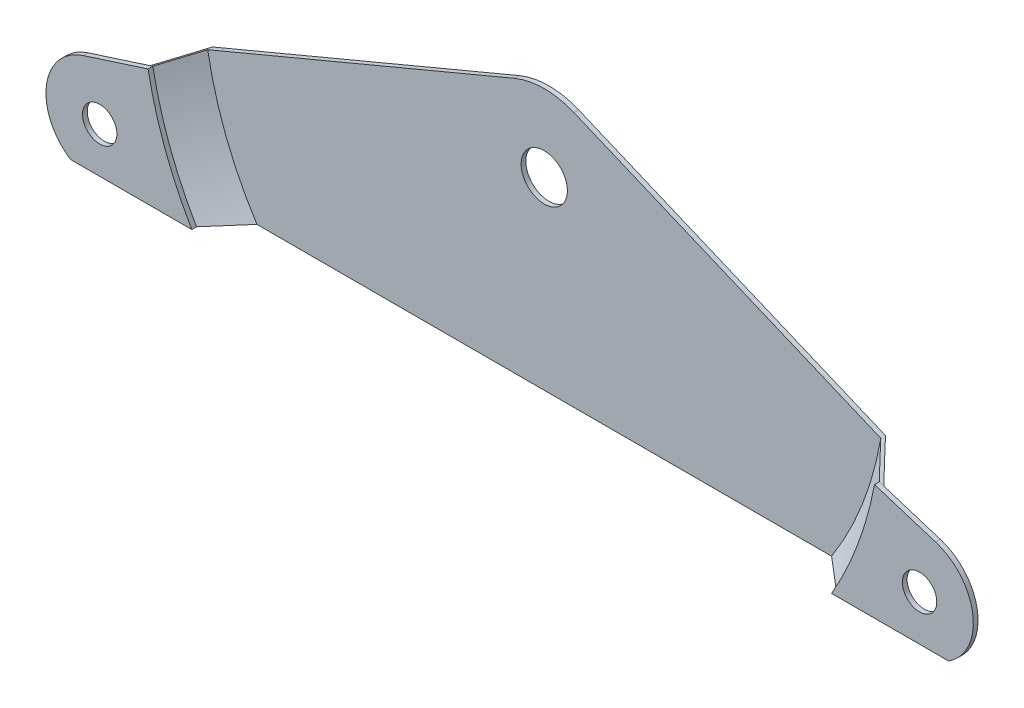
ISO-10303-21;
HEADER;
FILE_DESCRIPTION(('STEP AP214'),'2;1');
FILE_NAME('part.step','',(''),(''),'','','');
FILE_SCHEMA(('AUTOMOTIVE_DESIGN { 1 0 10303 214 1 1 1 1 }'));
ENDSEC;
DATA;
#1=APPLICATION_CONTEXT('core data for automotive mechanical design processes');
#2=APPLICATION_PROTOCOL_DEFINITION('international standard','automotive_design',2000,#1);
#3=PRODUCT_CONTEXT('',#1,'mechanical');
#4=PRODUCT('Part','Part','',(#3));
#5=PRODUCT_RELATED_PRODUCT_CATEGORY('part','',(#4));
#6=PRODUCT_DEFINITION_FORMATION('','',#4);
#7=PRODUCT_DEFINITION_CONTEXT('part definition',#1,'design');
#8=PRODUCT_DEFINITION('design','',#6,#7);
#9=PRODUCT_DEFINITION_SHAPE('','',#8);
#10=(LENGTH_UNIT() NAMED_UNIT(*) SI_UNIT(.MILLI.,.METRE.));
#11=(NAMED_UNIT(*) PLANE_ANGLE_UNIT() SI_UNIT($,.RADIAN.));
#12=(NAMED_UNIT(*) SI_UNIT($,.STERADIAN.) SOLID_ANGLE_UNIT());
#13=UNCERTAINTY_MEASURE_WITH_UNIT(LENGTH_MEASURE(1.E-05),#10,'distance_accuracy_value','');
#14=(GEOMETRIC_REPRESENTATION_CONTEXT(3) GLOBAL_UNCERTAINTY_ASSIGNED_CONTEXT((#13)) GLOBAL_UNIT_ASSIGNED_CONTEXT((#10,
#11,#12)) REPRESENTATION_CONTEXT('',''));
#15=CARTESIAN_POINT('',(0.,0.,0.));
#16=DIRECTION('',(0.,0.,1.));
#17=DIRECTION('',(1.,0.,0.));
#18=AXIS2_PLACEMENT_3D('',#15,#16,#17);
#19=CARTESIAN_POINT('',(0.,17.15,0.44));
#20=DIRECTION('',(0.,0.,1.));
#21=DIRECTION('',(1.,0.,0.));
#22=AXIS2_PLACEMENT_3D('',#19,#20,#21);
#23=PLANE('',#22);
#24=CARTESIAN_POINT('',(0.,17.15,0.44));
#25=DIRECTION('',(0.,0.,1.));
#26=DIRECTION('',(1.,0.,0.));
#27=AXIS2_PLACEMENT_3D('',#24,#25,#26);
#28=CIRCLE('',#27,31.7502897624573);
#29=CARTESIAN_POINT('',(26.72,0.,0.44));
#30=VERTEX_POINT('',#29);
#31=CARTESIAN_POINT('',(31.2934890172107,11.7835817224413,0.44));
#32=VERTEX_POINT('',#31);
#33=EDGE_CURVE('E83',#30,#32,#28,.T.);
#34=ORIENTED_EDGE('',*,*,#33,.T.);
#35=DIRECTION('',(0.922233709453363,-0.386632881617548,0.));
#36=VECTOR('',#35,1.);
#37=CARTESIAN_POINT('',(2.76442510356547,23.7439710225915,0.44));
#38=LINE('',#37,#36);
#39=CARTESIAN_POINT('',(2.76442510356547,23.7439710225915,0.44));
#40=VERTEX_POINT('',#39);
#41=EDGE_CURVE('E323',#40,#32,#38,.T.);
#42=ORIENTED_EDGE('',*,*,#41,.F.);
#43=CARTESIAN_POINT('',(0.,17.15,0.44));
#44=DIRECTION('',(0.,0.,1.));
#45=DIRECTION('',(1.,0.,0.));
#46=AXIS2_PLACEMENT_3D('',#43,#44,#45);
#47=CIRCLE('',#46,7.15);
#48=CARTESIAN_POINT('',(-2.76442510356547,23.7439710225915,0.44));
#49=VERTEX_POINT('',#48);
#50=EDGE_CURVE('E326',#40,#49,#47,.T.);
#51=ORIENTED_EDGE('',*,*,#50,.T.);
#52=DIRECTION('',(-0.922233709453363,-0.386632881617548,0.));
#53=VECTOR('',#52,1.);
#54=CARTESIAN_POINT('',(-2.76442510356547,23.7439710225915,0.44));
#55=LINE('',#54,#53);
#56=CARTESIAN_POINT('',(-31.2934890172107,11.7835817224414,0.44));
#57=VERTEX_POINT('',#56);
#58=EDGE_CURVE('E328',#49,#57,#55,.T.);
#59=ORIENTED_EDGE('',*,*,#58,.T.);
#60=CARTESIAN_POINT('',(0.,17.15,0.44));
#61=DIRECTION('',(0.,0.,1.));
#62=DIRECTION('',(1.,0.,0.));
#63=AXIS2_PLACEMENT_3D('',#60,#61,#62);
#64=CIRCLE('',#63,31.7502897624573);
#65=CARTESIAN_POINT('',(-26.72,0.,0.44));
#66=VERTEX_POINT('',#65);
#67=EDGE_CURVE('E331',#57,#66,#64,.T.);
#68=ORIENTED_EDGE('',*,*,#67,.T.);
#69=DIRECTION('',(1.,0.,0.));
#70=VECTOR('',#69,1.);
#71=CARTESIAN_POINT('',(-26.72,0.,0.44));
#72=LINE('',#71,#70);
#73=EDGE_CURVE('E54',#66,#30,#72,.T.);
#74=ORIENTED_EDGE('',*,*,#73,.T.);
#75=EDGE_LOOP('',(#34,#42,#51,#59,#68,#74));
#76=FACE_BOUND('',#75,.T.);
#77=CARTESIAN_POINT('',(0.,17.15,0.44));
#78=DIRECTION('',(0.,0.,1.));
#79=DIRECTION('',(1.,0.,0.));
#80=AXIS2_PLACEMENT_3D('',#77,#78,#79);
#81=CIRCLE('',#80,2.15);
#82=CARTESIAN_POINT('',(2.15,17.15,0.44));
#83=VERTEX_POINT('',#82);
#84=EDGE_CURVE('E316',#83,#83,#81,.T.);
#85=ORIENTED_EDGE('',*,*,#84,.F.);
#86=EDGE_LOOP('',(#85));
#87=FACE_BOUND('',#86,.T.);
#88=ADVANCED_FACE('F37',(#76,#87),#23,.T.);
#89=CARTESIAN_POINT('',(0.,17.15,0.));
#90=DIRECTION('',(0.,0.,1.));
#91=DIRECTION('',(1.,0.,0.));
#92=AXIS2_PLACEMENT_3D('',#89,#90,#91);
#93=PLANE('',#92);
#94=CARTESIAN_POINT('',(0.,17.15,0.));
#95=DIRECTION('',(0.,0.,1.));
#96=DIRECTION('',(1.,0.,0.));
#97=AXIS2_PLACEMENT_3D('',#94,#95,#96);
#98=CIRCLE('',#97,31.7502897624573);
#99=CARTESIAN_POINT('',(26.72,0.,0.));
#100=VERTEX_POINT('',#99);
#101=CARTESIAN_POINT('',(31.2934890172107,11.7835817224413,0.));
#102=VERTEX_POINT('',#101);
#103=EDGE_CURVE('E319',#100,#102,#98,.T.);
#104=ORIENTED_EDGE('',*,*,#103,.F.);
#105=DIRECTION('',(1.,0.,0.));
#106=VECTOR('',#105,1.);
#107=CARTESIAN_POINT('',(-26.72,0.,0.));
#108=LINE('',#107,#106);
#109=CARTESIAN_POINT('',(-26.72,0.,0.));
#110=VERTEX_POINT('',#109);
#111=EDGE_CURVE('E324',#110,#100,#108,.T.);
#112=ORIENTED_EDGE('',*,*,#111,.F.);
#113=CARTESIAN_POINT('',(0.,17.15,0.));
#114=DIRECTION('',(0.,0.,1.));
#115=DIRECTION('',(1.,0.,0.));
#116=AXIS2_PLACEMENT_3D('',#113,#114,#115);
#117=CIRCLE('',#116,31.7502897624573);
#118=CARTESIAN_POINT('',(-31.2934890172107,11.7835817224414,0.));
#119=VERTEX_POINT('',#118);
#120=EDGE_CURVE('E342',#119,#110,#117,.T.);
#121=ORIENTED_EDGE('',*,*,#120,.F.);
#122=DIRECTION('',(-0.922233709453363,-0.386632881617548,0.));
#123=VECTOR('',#122,1.);
#124=CARTESIAN_POINT('',(-2.76442510356547,23.7439710225915,0.));
#125=LINE('',#124,#123);
#126=CARTESIAN_POINT('',(-2.76442510356547,23.7439710225915,0.));
#127=VERTEX_POINT('',#126);
#128=EDGE_CURVE('E339',#127,#119,#125,.T.);
#129=ORIENTED_EDGE('',*,*,#128,.F.);
#130=CARTESIAN_POINT('',(0.,17.15,0.));
#131=DIRECTION('',(0.,0.,1.));
#132=DIRECTION('',(1.,0.,0.));
#133=AXIS2_PLACEMENT_3D('',#130,#131,#132);
#134=CIRCLE('',#133,7.15);
#135=CARTESIAN_POINT('',(2.76442510356547,23.7439710225915,0.));
#136=VERTEX_POINT('',#135);
#137=EDGE_CURVE('E71',#136,#127,#134,.T.);
#138=ORIENTED_EDGE('',*,*,#137,.F.);
#139=DIRECTION('',(0.922233709453363,-0.386632881617548,0.));
#140=VECTOR('',#139,1.);
#141=CARTESIAN_POINT('',(2.76442510356547,23.7439710225915,0.));
#142=LINE('',#141,#140);
#143=EDGE_CURVE('E336',#136,#102,#142,.T.);
#144=ORIENTED_EDGE('',*,*,#143,.T.);
#145=EDGE_LOOP('',(#104,#112,#121,#129,#138,#144));
#146=FACE_BOUND('',#145,.T.);
#147=CARTESIAN_POINT('',(0.,17.15,0.));
#148=DIRECTION('',(0.,0.,1.));
#149=DIRECTION('',(1.,0.,0.));
#150=AXIS2_PLACEMENT_3D('',#147,#148,#149);
#151=CIRCLE('',#150,2.15);
#152=CARTESIAN_POINT('',(2.15,17.15,0.));
#153=VERTEX_POINT('',#152);
#154=EDGE_CURVE('E307',#153,#153,#151,.T.);
#155=ORIENTED_EDGE('',*,*,#154,.T.);
#156=EDGE_LOOP('',(#155));
#157=FACE_BOUND('',#156,.T.);
#158=ADVANCED_FACE('F351',(#146,#157),#93,.F.);
#159=CARTESIAN_POINT('',(2.76442510356547,23.7439710225915,0.44));
#160=DIRECTION('',(0.386632881617548,0.922233709453363,0.));
#161=DIRECTION('',(-0.922233709453364,0.386632881617549,0.));
#162=AXIS2_PLACEMENT_3D('',#159,#160,#161);
#163=PLANE('',#162);
#164=ORIENTED_EDGE('',*,*,#143,.F.);
#165=DIRECTION('',(0.,0.,-1.));
#166=VECTOR('',#165,1.);
#167=CARTESIAN_POINT('',(2.76442510356547,23.7439710225915,0.44));
#168=LINE('',#167,#166);
#169=EDGE_CURVE('E11',#40,#136,#168,.T.);
#170=ORIENTED_EDGE('',*,*,#169,.F.);
#171=ORIENTED_EDGE('',*,*,#41,.T.);
#172=CARTESIAN_POINT('',(31.2934890172107,11.7835817224413,0.439999999999996));
#173=CARTESIAN_POINT('',(31.3937244432046,11.741559498362,0.547376328557561));
#174=CARTESIAN_POINT('',(31.4940485549675,11.6995000940819,0.654655292491744));
#175=CARTESIAN_POINT('',(31.6948676868934,11.6153096346956,0.869024973362242));
#176=CARTESIAN_POINT('',(31.7953627070515,11.5731785795913,0.976115690303785));
#177=CARTESIAN_POINT('',(31.9965171956317,11.4888475268735,1.19011536267099));
#178=CARTESIAN_POINT('',(32.0971766640494,11.4466475292617,1.2970243181013));
#179=CARTESIAN_POINT('',(32.2986539939737,11.3621811300716,1.51066658941956));
#180=CARTESIAN_POINT('',(32.3994718554765,11.3199147284949,1.61739990531165));
#181=CARTESIAN_POINT('',(32.6012602010364,11.2353179405865,1.83069676381163));
#182=CARTESIAN_POINT('',(32.7022306850901,11.1929875542561,1.9372603064232));
#183=CARTESIAN_POINT('',(32.9043187490583,11.1082651138252,2.15022325294046));
#184=CARTESIAN_POINT('',(33.0054363289699,11.0658730597259,2.25662265684941));
#185=CARTESIAN_POINT('',(33.3090241555674,10.9385983407276,2.57560581398307));
#186=CARTESIAN_POINT('',(33.5117074489869,10.8536263591277,2.78795122022613));
#187=CARTESIAN_POINT('',(33.7146543451012,10.7685438659855,3.));
#188=B_SPLINE_CURVE_WITH_KNOTS('',3,(#172,#173,#174,#175,#176,#177,#178,#179,#180,#181,#182,
#183,#184,#185,#186,#187),.UNSPECIFIED.,.F.,.F.,(4,2,2,2,2,2,2,4),(0.,0.45834929257985,
0.916698572435414,1.37504784060536,1.83339709803263,2.29174634557425,2.75009558401001,
3.66689417602485),.UNSPECIFIED.);
#189=CARTESIAN_POINT('',(33.7146543451012,10.7685438659855,3.));
#190=VERTEX_POINT('',#189);
#191=EDGE_CURVE('E264',#32,#190,#188,.T.);
#192=ORIENTED_EDGE('',*,*,#191,.T.);
#193=DIRECTION('',(0.922233709453363,-0.386632881617548,0.));
#194=VECTOR('',#193,1.);
#195=CARTESIAN_POINT('',(32.0769910670564,11.4551100431046,3.));
#196=LINE('',#195,#194);
#197=CARTESIAN_POINT('',(34.1365470888751,10.5916715552179,3.));
#198=VERTEX_POINT('',#197);
#199=EDGE_CURVE('E248',#190,#198,#196,.T.);
#200=ORIENTED_EDGE('',*,*,#199,.T.);
#201=CARTESIAN_POINT('',(31.2934890172107,11.7835817224413,0.));
#202=CARTESIAN_POINT('',(31.411073822907,11.7342860267898,0.125961616807111));
#203=CARTESIAN_POINT('',(31.528780611439,11.6849391916334,0.251789300614221));
#204=CARTESIAN_POINT('',(31.764427838143,11.5861475671549,0.503187160262692));
#205=CARTESIAN_POINT('',(31.8823682763046,11.5367027778371,0.628757336115454));
#206=CARTESIAN_POINT('',(32.1184724919191,11.4377195674975,0.879650544013821));
#207=CARTESIAN_POINT('',(32.236636269363,11.3881811464795,1.00497357606933));
#208=CARTESIAN_POINT('',(32.4731776054817,11.2890146798151,1.25538218371635));
#209=CARTESIAN_POINT('',(32.5915551641487,11.2393866341721,1.3804677593165));
#210=CARTESIAN_POINT('',(32.8285150243897,11.1400447074419,1.63041067141581));
#211=CARTESIAN_POINT('',(32.9470973259569,11.0903308263575,1.7552680079225));
#212=CARTESIAN_POINT('',(33.1844580794141,10.9908208310587,2.00476323693646));
#213=CARTESIAN_POINT('',(33.3032365312982,10.9410247168468,2.1294011294503));
#214=CARTESIAN_POINT('',(33.6598888715091,10.7915034831097,2.50303405643968));
#215=CARTESIAN_POINT('',(33.8980453261787,10.6916599018126,2.75171204610829));
#216=CARTESIAN_POINT('',(34.1365470888751,10.5916715552179,2.99999999999999));
#217=B_SPLINE_CURVE_WITH_KNOTS('',3,(#201,#202,#203,#204,#205,#206,#207,#208,#209,#210,#211,
#212,#213,#214,#215,#216),.UNSPECIFIED.,.F.,.F.,(4,2,2,2,2,2,2,4),(0.,0.537683056477287,
1.07536608914951,1.61304910027385,2.15073209186624,2.68841506573006,3.2260980234809,
4.30162011381698),.UNSPECIFIED.);
#218=EDGE_CURVE('E239',#102,#198,#217,.T.);
#219=ORIENTED_EDGE('',*,*,#218,.F.);
#220=EDGE_LOOP('',(#164,#170,#171,#192,#200,#219));
#221=FACE_BOUND('',#220,.T.);
#222=ADVANCED_FACE('F39',(#221),#163,.T.);
#223=CARTESIAN_POINT('',(0.,17.15,0.44));
#224=DIRECTION('',(0.,0.,-1.));
#225=DIRECTION('',(-1.,0.,0.));
#226=AXIS2_PLACEMENT_3D('',#223,#224,#225);
#227=CYLINDRICAL_SURFACE('',#226,7.15);
#228=ORIENTED_EDGE('',*,*,#137,.T.);
#229=DIRECTION('',(0.,0.,-1.));
#230=VECTOR('',#229,1.);
#231=CARTESIAN_POINT('',(-2.76442510356547,23.7439710225915,0.44));
#232=LINE('',#231,#230);
#233=EDGE_CURVE('E46',#49,#127,#232,.T.);
#234=ORIENTED_EDGE('',*,*,#233,.F.);
#235=ORIENTED_EDGE('',*,*,#50,.F.);
#236=ORIENTED_EDGE('',*,*,#169,.T.);
#237=EDGE_LOOP('',(#228,#234,#235,#236));
#238=FACE_BOUND('',#237,.T.);
#239=ADVANCED_FACE('F393',(#238),#227,.T.);
#240=CARTESIAN_POINT('',(-2.76442510356547,23.7439710225915,0.44));
#241=DIRECTION('',(0.386632881617548,-0.922233709453363,0.));
#242=DIRECTION('',(0.922233709453364,0.386632881617549,0.));
#243=AXIS2_PLACEMENT_3D('',#240,#241,#242);
#244=PLANE('',#243);
#245=ORIENTED_EDGE('',*,*,#128,.T.);
#246=CARTESIAN_POINT('',(-31.2934890172107,11.7835817224414,0.));
#247=CARTESIAN_POINT('',(-31.3935358678006,11.741638555819,0.144015507318277));
#248=CARTESIAN_POINT('',(-31.4936968584917,11.6996475376426,0.2879377617559));
#249=CARTESIAN_POINT('',(-31.6942392222848,11.6155731092142,0.575601627920605));
#250=CARTESIAN_POINT('',(-31.7946205953814,11.5734896989644,0.719343239652119));
#251=CARTESIAN_POINT('',(-31.9955958288291,11.4892337963172,1.00665168726992));
#252=CARTESIAN_POINT('',(-32.0961896891755,11.4470613039218,1.15021852316016));
#253=CARTESIAN_POINT('',(-32.2975824621525,11.3626303539848,1.43718298480388));
#254=CARTESIAN_POINT('',(-32.3983813747788,11.3203718964451,1.5805806105609));
#255=CARTESIAN_POINT('',(-32.6001771433053,11.2357719965674,1.86721200431611));
#256=CARTESIAN_POINT('',(-32.7011739992016,11.193430554231,2.01044577231745));
#257=CARTESIAN_POINT('',(-32.9033588262871,11.1086675472902,2.29675460648234));
#258=CARTESIAN_POINT('',(-33.004546797473,11.0662459826872,2.43982967264871));
#259=CARTESIAN_POINT('',(-33.3084084004745,10.9388564869692,2.86885311570798));
#260=CARTESIAN_POINT('',(-33.5113592626003,10.8537723311352,3.1545706826577));
#261=CARTESIAN_POINT('',(-33.7146543451012,10.7685438659856,3.44));
#262=B_SPLINE_CURVE_WITH_KNOTS('',3,(#246,#247,#248,#249,#250,#251,#252,#253,#254,#255,#256,
#257,#258,#259,#260,#261),.UNSPECIFIED.,.F.,.F.,(4,2,2,2,2,2,2,4),(0.,0.540908040717193,
1.08181606816377,1.62272408336761,2.16363208726768,2.70454008072246,3.24544806451752,
4.32737369835709),.UNSPECIFIED.);
#263=CARTESIAN_POINT('',(-33.7146543451012,10.7685438659856,3.44));
#264=VERTEX_POINT('',#263);
#265=EDGE_CURVE('E280',#119,#264,#262,.T.);
#266=ORIENTED_EDGE('',*,*,#265,.T.);
#267=DIRECTION('',(-0.922233709453363,-0.386632881617548,0.));
#268=VECTOR('',#267,1.);
#269=CARTESIAN_POINT('',(-32.0337255340358,11.4732484797449,3.44));
#270=LINE('',#269,#268);
#271=CARTESIAN_POINT('',(-33.4017072691771,10.8997423122341,3.44));
#272=VERTEX_POINT('',#271);
#273=EDGE_CURVE('E287',#272,#264,#270,.T.);
#274=ORIENTED_EDGE('',*,*,#273,.F.);
#275=CARTESIAN_POINT('',(-31.2934890172107,11.7835817224414,0.439999999999998));
#276=CARTESIAN_POINT('',(-31.3806899271586,11.7470240269817,0.565524065928203));
#277=CARTESIAN_POINT('',(-31.4679775724034,11.710429969028,0.690977273051971));
#278=CARTESIAN_POINT('',(-31.6427210628983,11.6371713377489,0.941745878989));
#279=CARTESIAN_POINT('',(-31.7301769081456,11.6005067644248,1.06706127780452));
#280=CARTESIAN_POINT('',(-31.9052515295779,11.5271093113837,1.31755817862386));
#281=CARTESIAN_POINT('',(-31.9928703057605,11.4903764316678,1.44273968062972));
#282=CARTESIAN_POINT('',(-32.1682657890497,11.4168444620253,1.69297252356436));
#283=CARTESIAN_POINT('',(-32.2560424961541,11.3800453720997,1.81802386449498));
#284=CARTESIAN_POINT('',(-32.4317490341395,11.3063829973632,2.06799999557107));
#285=CARTESIAN_POINT('',(-32.5196788650186,11.2695197125533,2.19292478571822));
#286=CARTESIAN_POINT('',(-32.6956870094469,11.1957308937637,2.44265130883514));
#287=CARTESIAN_POINT('',(-32.7837653229943,11.1588053597849,2.56745304180643));
#288=CARTESIAN_POINT('',(-33.0482303820857,11.0479322840823,2.94169833998582));
#289=CARTESIAN_POINT('',(-33.2248333729155,10.9738940847117,3.19096227027952));
#290=CARTESIAN_POINT('',(-33.4017072691771,10.8997423122341,3.44));
#291=B_SPLINE_CURVE_WITH_KNOTS('',3,(#275,#276,#277,#278,#279,#280,#281,#282,#283,#284,#285,
#286,#287,#288,#289,#290),.UNSPECIFIED.,.F.,.F.,(4,2,2,2,2,2,2,4),(0.,0.471455975874309,
0.942911944023858,1.4143679049737,1.88582385920898,2.35727980717827,2.82873574929661,
3.77172207501721),.UNSPECIFIED.);
#292=EDGE_CURVE('E300',#57,#272,#291,.T.);
#293=ORIENTED_EDGE('',*,*,#292,.F.);
#294=ORIENTED_EDGE('',*,*,#58,.F.);
#295=ORIENTED_EDGE('',*,*,#233,.T.);
#296=EDGE_LOOP('',(#245,#266,#274,#293,#294,#295));
#297=FACE_BOUND('',#296,.T.);
#298=ADVANCED_FACE('F347',(#297),#244,.F.);
#299=CARTESIAN_POINT('',(-26.72,0.,0.44));
#300=DIRECTION('',(0.,1.,0.));
#301=DIRECTION('',(0.,0.,1.));
#302=AXIS2_PLACEMENT_3D('',#299,#300,#301);
#303=PLANE('',#302);
#304=ORIENTED_EDGE('',*,*,#111,.T.);
#305=DIRECTION('',(0.76068664534764,0.,0.649119270696652));
#306=VECTOR('',#305,1.);
#307=CARTESIAN_POINT('',(26.72,0.,0.));
#308=LINE('',#307,#306);
#309=CARTESIAN_POINT('',(30.235625,0.,3.));
#310=VERTEX_POINT('',#309);
#311=EDGE_CURVE('E271',#100,#310,#308,.T.);
#312=ORIENTED_EDGE('',*,*,#311,.T.);
#313=DIRECTION('',(1.,0.,0.));
#314=VECTOR('',#313,1.);
#315=CARTESIAN_POINT('',(29.72,0.,3.));
#316=LINE('',#315,#314);
#317=CARTESIAN_POINT('',(40.606344477051,0.,3.));
#318=VERTEX_POINT('',#317);
#319=EDGE_CURVE('E215',#310,#318,#316,.T.);
#320=ORIENTED_EDGE('',*,*,#319,.T.);
#321=DIRECTION('',(0.,0.,-1.));
#322=VECTOR('',#321,1.);
#323=CARTESIAN_POINT('',(40.606344477051,0.,3.44));
#324=LINE('',#323,#322);
#325=CARTESIAN_POINT('',(40.606344477051,0.,3.44));
#326=VERTEX_POINT('',#325);
#327=EDGE_CURVE('E231',#326,#318,#324,.T.);
#328=ORIENTED_EDGE('',*,*,#327,.F.);
#329=DIRECTION('',(1.,0.,0.));
#330=VECTOR('',#329,1.);
#331=CARTESIAN_POINT('',(29.72,0.,3.44));
#332=LINE('',#331,#330);
#333=CARTESIAN_POINT('',(29.72,0.,3.44));
#334=VERTEX_POINT('',#333);
#335=EDGE_CURVE('E219',#334,#326,#332,.T.);
#336=ORIENTED_EDGE('',*,*,#335,.F.);
#337=DIRECTION('',(0.,0.,-1.));
#338=VECTOR('',#337,1.);
#339=CARTESIAN_POINT('',(29.72,0.,3.44));
#340=LINE('',#339,#338);
#341=CARTESIAN_POINT('',(29.72,0.,3.));
#342=VERTEX_POINT('',#341);
#343=EDGE_CURVE('E227',#334,#342,#340,.T.);
#344=ORIENTED_EDGE('',*,*,#343,.T.);
#345=DIRECTION('',(0.76068664534764,0.,0.649119270696653));
#346=VECTOR('',#345,1.);
#347=CARTESIAN_POINT('',(26.72,0.,0.44));
#348=LINE('',#347,#346);
#349=EDGE_CURVE('E230',#30,#342,#348,.T.);
#350=ORIENTED_EDGE('',*,*,#349,.F.);
#351=ORIENTED_EDGE('',*,*,#73,.F.);
#352=DIRECTION('',(-0.65726286253734,0.,0.753661415709483));
#353=VECTOR('',#352,1.);
#354=CARTESIAN_POINT('',(-26.72,0.,0.44));
#355=LINE('',#354,#353);
#356=CARTESIAN_POINT('',(-29.3362790697674,0.,3.44));
#357=VERTEX_POINT('',#356);
#358=EDGE_CURVE('E164',#66,#357,#355,.T.);
#359=ORIENTED_EDGE('',*,*,#358,.T.);
#360=DIRECTION('',(0.,0.,-1.));
#361=VECTOR('',#360,1.);
#362=CARTESIAN_POINT('',(-29.3362790697674,0.,3.88));
#363=LINE('',#362,#361);
#364=CARTESIAN_POINT('',(-29.3362790697674,0.,3.88));
#365=VERTEX_POINT('',#364);
#366=EDGE_CURVE('E159',#365,#357,#363,.T.);
#367=ORIENTED_EDGE('',*,*,#366,.F.);
#368=DIRECTION('',(-1.,0.,0.));
#369=VECTOR('',#368,1.);
#370=CARTESIAN_POINT('',(-29.3362790697674,0.,3.88));
#371=LINE('',#370,#369);
#372=CARTESIAN_POINT('',(-40.606344477051,0.,3.88));
#373=VERTEX_POINT('',#372);
#374=EDGE_CURVE('E163',#365,#373,#371,.T.);
#375=ORIENTED_EDGE('',*,*,#374,.T.);
#376=DIRECTION('',(0.,0.,-1.));
#377=VECTOR('',#376,1.);
#378=CARTESIAN_POINT('',(-40.606344477051,0.,3.88));
#379=LINE('',#378,#377);
#380=CARTESIAN_POINT('',(-40.606344477051,0.,3.44));
#381=VERTEX_POINT('',#380);
#382=EDGE_CURVE('E168',#373,#381,#379,.T.);
#383=ORIENTED_EDGE('',*,*,#382,.T.);
#384=DIRECTION('',(-1.,0.,0.));
#385=VECTOR('',#384,1.);
#386=CARTESIAN_POINT('',(-29.3362790697674,0.,3.44));
#387=LINE('',#386,#385);
#388=CARTESIAN_POINT('',(-29.72,0.,3.44));
#389=VERTEX_POINT('',#388);
#390=EDGE_CURVE('E194',#389,#381,#387,.T.);
#391=ORIENTED_EDGE('',*,*,#390,.F.);
#392=DIRECTION('',(-0.65726286253734,0.,0.753661415709483));
#393=VECTOR('',#392,1.);
#394=CARTESIAN_POINT('',(-26.72,0.,0.));
#395=LINE('',#394,#393);
#396=EDGE_CURVE('E79',#110,#389,#395,.T.);
#397=ORIENTED_EDGE('',*,*,#396,.F.);
#398=EDGE_LOOP('',(#304,#312,#320,#328,#336,#344,#350,#351,#359,#367,#375,#383,#391,#397));
#399=FACE_BOUND('',#398,.T.);
#400=ADVANCED_FACE('F161',(#399),#303,.F.);
#401=CARTESIAN_POINT('',(0.,17.15,0.44));
#402=DIRECTION('',(0.,0.,-1.));
#403=DIRECTION('',(-1.,0.,0.));
#404=AXIS2_PLACEMENT_3D('',#401,#402,#403);
#405=CYLINDRICAL_SURFACE('',#404,2.15);
#406=ORIENTED_EDGE('',*,*,#84,.T.);
#407=EDGE_LOOP('',(#406));
#408=FACE_BOUND('',#407,.T.);
#409=ORIENTED_EDGE('',*,*,#154,.F.);
#410=EDGE_LOOP('',(#409));
#411=FACE_BOUND('',#410,.T.);
#412=ADVANCED_FACE('F388',(#408,#411),#405,.F.);
#413=DIRECTION('',(-0.577590286868506,0.31366212870848,0.753661415709483));
#414=VECTOR('',#413,1.);
#415=CARTESIAN_POINT('',(-31.665440356893,14.8303476544855,0.44));
#416=LINE('',#415,#414);
#417=CARTESIAN_POINT('',(0.,17.15,0.44));
#418=DIRECTION('',(0.,0.,1.));
#419=AXIS1_PLACEMENT('',#417,#418);
#420=SURFACE_OF_REVOLUTION('',#416,#419);
#421=ORIENTED_EDGE('',*,*,#67,.F.);
#422=ORIENTED_EDGE('',*,*,#292,.T.);
#423=CARTESIAN_POINT('',(0.,17.15,3.44));
#424=DIRECTION('',(0.,0.,1.));
#425=DIRECTION('',(1.,0.,0.));
#426=AXIS2_PLACEMENT_3D('',#423,#424,#425);
#427=CIRCLE('',#426,33.981462147166);
#428=EDGE_CURVE('E288',#272,#357,#427,.T.);
#429=ORIENTED_EDGE('',*,*,#428,.T.);
#430=ORIENTED_EDGE('',*,*,#358,.F.);
#431=EDGE_LOOP('',(#421,#422,#429,#430));
#432=FACE_BOUND('',#431,.T.);
#433=ADVANCED_FACE('F296',(#432),#420,.F.);
#434=DIRECTION('',(-0.577590286868506,0.31366212870848,0.753661415709483));
#435=VECTOR('',#434,1.);
#436=CARTESIAN_POINT('',(-31.665440356893,14.8303476544855,0.));
#437=LINE('',#436,#435);
#438=CARTESIAN_POINT('',(0.,17.15,0.44));
#439=DIRECTION('',(0.,0.,1.));
#440=AXIS1_PLACEMENT('',#438,#439);
#441=SURFACE_OF_REVOLUTION('',#437,#440);
#442=ORIENTED_EDGE('',*,*,#265,.F.);
#443=ORIENTED_EDGE('',*,*,#120,.T.);
#444=ORIENTED_EDGE('',*,*,#396,.T.);
#445=CARTESIAN_POINT('',(0.,17.15,3.44));
#446=DIRECTION('',(0.,0.,1.));
#447=DIRECTION('',(1.,0.,0.));
#448=AXIS2_PLACEMENT_3D('',#445,#446,#447);
#449=CIRCLE('',#448,34.3132758564378);
#450=EDGE_CURVE('E309',#264,#389,#449,.T.);
#451=ORIENTED_EDGE('',*,*,#450,.F.);
#452=EDGE_LOOP('',(#442,#443,#444,#451));
#453=FACE_BOUND('',#452,.T.);
#454=ADVANCED_FACE('F290',(#453),#441,.T.);
#455=DIRECTION('',(0.662869450367109,0.373159837308696,0.649119270696652));
#456=VECTOR('',#455,1.);
#457=CARTESIAN_POINT('',(31.6971029675881,15.3130015073172,0.));
#458=LINE('',#457,#456);
#459=CARTESIAN_POINT('',(0.,17.15,0.44));
#460=DIRECTION('',(0.,0.,-1.));
#461=AXIS1_PLACEMENT('',#459,#460);
#462=SURFACE_OF_REVOLUTION('',#458,#461);
#463=ORIENTED_EDGE('',*,*,#103,.T.);
#464=ORIENTED_EDGE('',*,*,#218,.T.);
#465=CARTESIAN_POINT('',(0.,17.15,3.));
#466=DIRECTION('',(0.,0.,-1.));
#467=DIRECTION('',(-1.,0.,0.));
#468=AXIS2_PLACEMENT_3D('',#465,#466,#467);
#469=CIRCLE('',#468,34.7608331191964);
#470=EDGE_CURVE('E273',#198,#310,#469,.T.);
#471=ORIENTED_EDGE('',*,*,#470,.T.);
#472=ORIENTED_EDGE('',*,*,#311,.F.);
#473=EDGE_LOOP('',(#463,#464,#471,#472));
#474=FACE_BOUND('',#473,.T.);
#475=ADVANCED_FACE('F251',(#474),#462,.F.);
#476=DIRECTION('',(0.662869450367109,0.373159837308696,0.649119270696653));
#477=VECTOR('',#476,1.);
#478=CARTESIAN_POINT('',(31.6971029675881,15.3130015073172,0.44));
#479=LINE('',#478,#477);
#480=CARTESIAN_POINT('',(0.,17.15,0.44));
#481=DIRECTION('',(0.,0.,-1.));
#482=AXIS1_PLACEMENT('',#480,#481);
#483=SURFACE_OF_REVOLUTION('',#479,#482);
#484=ORIENTED_EDGE('',*,*,#191,.F.);
#485=ORIENTED_EDGE('',*,*,#33,.F.);
#486=ORIENTED_EDGE('',*,*,#349,.T.);
#487=CARTESIAN_POINT('',(0.,17.15,3.));
#488=DIRECTION('',(0.,0.,-1.));
#489=DIRECTION('',(-1.,0.,0.));
#490=AXIS2_PLACEMENT_3D('',#487,#488,#489);
#491=CIRCLE('',#490,34.3132758564378);
#492=EDGE_CURVE('E249',#190,#342,#491,.T.);
#493=ORIENTED_EDGE('',*,*,#492,.F.);
#494=EDGE_LOOP('',(#484,#485,#486,#493));
#495=FACE_BOUND('',#494,.T.);
#496=ADVANCED_FACE('F260',(#495),#483,.T.);
#497=CARTESIAN_POINT('',(0.,17.15,3.44));
#498=DIRECTION('',(0.,0.,1.));
#499=DIRECTION('',(1.,0.,0.));
#500=AXIS2_PLACEMENT_3D('',#497,#498,#499);
#501=PLANE('',#500);
#502=CARTESIAN_POINT('',(0.,17.15,3.44));
#503=DIRECTION('',(0.,0.,1.));
#504=DIRECTION('',(1.,0.,0.));
#505=AXIS2_PLACEMENT_3D('',#502,#503,#504);
#506=CIRCLE('',#505,34.3132758564378);
#507=CARTESIAN_POINT('',(33.7146543451012,10.7685438659855,3.44));
#508=VERTEX_POINT('',#507);
#509=EDGE_CURVE('E211',#334,#508,#506,.T.);
#510=ORIENTED_EDGE('',*,*,#509,.F.);
#511=ORIENTED_EDGE('',*,*,#335,.T.);
#512=CARTESIAN_POINT('',(37.9,4.20424780091941,3.44));
#513=DIRECTION('',(0.,0.,1.));
#514=DIRECTION('',(1.,0.,0.));
#515=AXIS2_PLACEMENT_3D('',#512,#513,#514);
#516=CIRCLE('',#515,5.);
#517=CARTESIAN_POINT('',(39.4050656399768,8.97234778092833,3.44));
#518=VERTEX_POINT('',#517);
#519=EDGE_CURVE('E217',#326,#518,#516,.T.);
#520=ORIENTED_EDGE('',*,*,#519,.T.);
#521=DIRECTION('',(-0.953619996001785,0.301013127995367,0.));
#522=VECTOR('',#521,1.);
#523=CARTESIAN_POINT('',(39.4050656399768,8.97234778092833,3.44));
#524=LINE('',#523,#522);
#525=EDGE_CURVE('E214',#518,#508,#524,.T.);
#526=ORIENTED_EDGE('',*,*,#525,.T.);
#527=EDGE_LOOP('',(#510,#511,#520,#526));
#528=FACE_BOUND('',#527,.T.);
#529=CARTESIAN_POINT('',(37.9,4.20424780091941,3.44));
#530=DIRECTION('',(0.,0.,1.));
#531=DIRECTION('',(1.,0.,0.));
#532=AXIS2_PLACEMENT_3D('',#529,#530,#531);
#533=CIRCLE('',#532,1.6);
#534=CARTESIAN_POINT('',(39.5,4.20424780091941,3.44));
#535=VERTEX_POINT('',#534);
#536=EDGE_CURVE('E205',#535,#535,#533,.T.);
#537=ORIENTED_EDGE('',*,*,#536,.F.);
#538=EDGE_LOOP('',(#537));
#539=FACE_BOUND('',#538,.T.);
#540=ADVANCED_FACE('F421',(#528,#539),#501,.T.);
#541=CARTESIAN_POINT('',(0.,17.15,3.));
#542=DIRECTION('',(0.,0.,1.));
#543=DIRECTION('',(1.,0.,0.));
#544=AXIS2_PLACEMENT_3D('',#541,#542,#543);
#545=PLANE('',#544);
#546=ORIENTED_EDGE('',*,*,#199,.F.);
#547=DIRECTION('',(-0.953619996001785,0.301013127995367,0.));
#548=VECTOR('',#547,1.);
#549=CARTESIAN_POINT('',(39.4050656399768,8.97234778092833,3.));
#550=LINE('',#549,#548);
#551=CARTESIAN_POINT('',(39.4050656399768,8.97234778092833,3.));
#552=VERTEX_POINT('',#551);
#553=EDGE_CURVE('E208',#552,#190,#550,.T.);
#554=ORIENTED_EDGE('',*,*,#553,.F.);
#555=CARTESIAN_POINT('',(37.9,4.20424780091941,3.));
#556=DIRECTION('',(0.,0.,1.));
#557=DIRECTION('',(1.,0.,0.));
#558=AXIS2_PLACEMENT_3D('',#555,#556,#557);
#559=CIRCLE('',#558,5.);
#560=EDGE_CURVE('E224',#318,#552,#559,.T.);
#561=ORIENTED_EDGE('',*,*,#560,.F.);
#562=ORIENTED_EDGE('',*,*,#319,.F.);
#563=ORIENTED_EDGE('',*,*,#470,.F.);
#564=EDGE_LOOP('',(#546,#554,#561,#562,#563));
#565=FACE_BOUND('',#564,.T.);
#566=CARTESIAN_POINT('',(37.9,4.20424780091941,3.));
#567=DIRECTION('',(0.,0.,1.));
#568=DIRECTION('',(1.,0.,0.));
#569=AXIS2_PLACEMENT_3D('',#566,#567,#568);
#570=CIRCLE('',#569,1.6);
#571=CARTESIAN_POINT('',(39.5,4.20424780091941,3.));
#572=VERTEX_POINT('',#571);
#573=EDGE_CURVE('E200',#572,#572,#570,.T.);
#574=ORIENTED_EDGE('',*,*,#573,.T.);
#575=EDGE_LOOP('',(#574));
#576=FACE_BOUND('',#575,.T.);
#577=ADVANCED_FACE('F408',(#565,#576),#545,.F.);
#578=CARTESIAN_POINT('',(0.,17.15,3.44));
#579=DIRECTION('',(0.,0.,-1.));
#580=DIRECTION('',(-1.,0.,0.));
#581=AXIS2_PLACEMENT_3D('',#578,#579,#580);
#582=CYLINDRICAL_SURFACE('',#581,34.3132758564378);
#583=ORIENTED_EDGE('',*,*,#492,.T.);
#584=ORIENTED_EDGE('',*,*,#343,.F.);
#585=ORIENTED_EDGE('',*,*,#509,.T.);
#586=DIRECTION('',(0.,0.,-1.));
#587=VECTOR('',#586,1.);
#588=CARTESIAN_POINT('',(33.7146543451012,10.7685438659855,3.44));
#589=LINE('',#588,#587);
#590=EDGE_CURVE('E221',#508,#190,#589,.T.);
#591=ORIENTED_EDGE('',*,*,#590,.T.);
#592=EDGE_LOOP('',(#583,#584,#585,#591));
#593=FACE_BOUND('',#592,.T.);
#594=ADVANCED_FACE('F258',(#593),#582,.F.);
#595=CARTESIAN_POINT('',(37.9,4.20424780091941,3.44));
#596=DIRECTION('',(0.,0.,-1.));
#597=DIRECTION('',(-1.,0.,0.));
#598=AXIS2_PLACEMENT_3D('',#595,#596,#597);
#599=CYLINDRICAL_SURFACE('',#598,5.);
#600=ORIENTED_EDGE('',*,*,#560,.T.);
#601=DIRECTION('',(0.,0.,-1.));
#602=VECTOR('',#601,1.);
#603=CARTESIAN_POINT('',(39.4050656399768,8.97234778092833,3.44));
#604=LINE('',#603,#602);
#605=EDGE_CURVE('E234',#518,#552,#604,.T.);
#606=ORIENTED_EDGE('',*,*,#605,.F.);
#607=ORIENTED_EDGE('',*,*,#519,.F.);
#608=ORIENTED_EDGE('',*,*,#327,.T.);
#609=EDGE_LOOP('',(#600,#606,#607,#608));
#610=FACE_BOUND('',#609,.T.);
#611=ADVANCED_FACE('F416',(#610),#599,.T.);
#612=CARTESIAN_POINT('',(39.4050656399768,8.97234778092833,3.44));
#613=DIRECTION('',(-0.301013127995367,-0.953619996001785,0.));
#614=DIRECTION('',(0.953619996001785,-0.301013127995367,0.));
#615=AXIS2_PLACEMENT_3D('',#612,#613,#614);
#616=PLANE('',#615);
#617=ORIENTED_EDGE('',*,*,#553,.T.);
#618=ORIENTED_EDGE('',*,*,#590,.F.);
#619=ORIENTED_EDGE('',*,*,#525,.F.);
#620=ORIENTED_EDGE('',*,*,#605,.T.);
#621=EDGE_LOOP('',(#617,#618,#619,#620));
#622=FACE_BOUND('',#621,.T.);
#623=ADVANCED_FACE('F470',(#622),#616,.F.);
#624=CARTESIAN_POINT('',(37.9,4.20424780091941,3.44));
#625=DIRECTION('',(0.,0.,-1.));
#626=DIRECTION('',(-1.,0.,0.));
#627=AXIS2_PLACEMENT_3D('',#624,#625,#626);
#628=CYLINDRICAL_SURFACE('',#627,1.6);
#629=ORIENTED_EDGE('',*,*,#536,.T.);
#630=EDGE_LOOP('',(#629));
#631=FACE_BOUND('',#630,.T.);
#632=ORIENTED_EDGE('',*,*,#573,.F.);
#633=EDGE_LOOP('',(#632));
#634=FACE_BOUND('',#633,.T.);
#635=ADVANCED_FACE('F465',(#631,#634),#628,.F.);
#636=CARTESIAN_POINT('',(0.,17.15,3.88));
#637=DIRECTION('',(0.,0.,1.));
#638=DIRECTION('',(1.,0.,0.));
#639=AXIS2_PLACEMENT_3D('',#636,#637,#638);
#640=PLANE('',#639);
#641=CARTESIAN_POINT('',(0.,17.15,3.88));
#642=DIRECTION('',(0.,0.,1.));
#643=DIRECTION('',(1.,0.,0.));
#644=AXIS2_PLACEMENT_3D('',#641,#642,#643);
#645=CIRCLE('',#644,33.981462147166);
#646=CARTESIAN_POINT('',(-33.4017072691771,10.8997423122341,3.88));
#647=VERTEX_POINT('',#646);
#648=EDGE_CURVE('E175',#647,#365,#645,.T.);
#649=ORIENTED_EDGE('',*,*,#648,.F.);
#650=DIRECTION('',(-0.952135663469201,-0.305675773246859,0.));
#651=VECTOR('',#650,1.);
#652=CARTESIAN_POINT('',(-33.4017072691771,10.8997423122341,3.88));
#653=LINE('',#652,#651);
#654=CARTESIAN_POINT('',(-39.4283788662343,8.96492611826542,3.88));
#655=VERTEX_POINT('',#654);
#656=EDGE_CURVE('E169',#647,#655,#653,.T.);
#657=ORIENTED_EDGE('',*,*,#656,.T.);
#658=CARTESIAN_POINT('',(-37.9,4.2042478009194,3.88));
#659=DIRECTION('',(0.,0.,1.));
#660=DIRECTION('',(1.,0.,0.));
#661=AXIS2_PLACEMENT_3D('',#658,#659,#660);
#662=CIRCLE('',#661,5.00000000000001);
#663=EDGE_CURVE('E177',#655,#373,#662,.T.);
#664=ORIENTED_EDGE('',*,*,#663,.T.);
#665=ORIENTED_EDGE('',*,*,#374,.F.);
#666=EDGE_LOOP('',(#649,#657,#664,#665));
#667=FACE_BOUND('',#666,.T.);
#668=CARTESIAN_POINT('',(-37.9,4.2042478009194,3.88));
#669=DIRECTION('',(0.,0.,1.));
#670=DIRECTION('',(1.,0.,0.));
#671=AXIS2_PLACEMENT_3D('',#668,#669,#670);
#672=CIRCLE('',#671,1.6);
#673=CARTESIAN_POINT('',(-36.3,4.2042478009194,3.88));
#674=VERTEX_POINT('',#673);
#675=EDGE_CURVE('E196',#674,#674,#672,.T.);
#676=ORIENTED_EDGE('',*,*,#675,.F.);
#677=EDGE_LOOP('',(#676));
#678=FACE_BOUND('',#677,.T.);
#679=ADVANCED_FACE('F173',(#667,#678),#640,.T.);
#680=CARTESIAN_POINT('',(0.,17.15,3.44));
#681=DIRECTION('',(0.,0.,1.));
#682=DIRECTION('',(1.,0.,0.));
#683=AXIS2_PLACEMENT_3D('',#680,#681,#682);
#684=PLANE('',#683);
#685=DIRECTION('',(-0.952135663469201,-0.305675773246859,0.));
#686=VECTOR('',#685,1.);
#687=CARTESIAN_POINT('',(-33.4017072691771,10.8997423122341,3.44));
#688=LINE('',#687,#686);
#689=CARTESIAN_POINT('',(-39.4283788662343,8.96492611826542,3.44));
#690=VERTEX_POINT('',#689);
#691=EDGE_CURVE('E184',#272,#690,#688,.T.);
#692=ORIENTED_EDGE('',*,*,#691,.F.);
#693=ORIENTED_EDGE('',*,*,#273,.T.);
#694=ORIENTED_EDGE('',*,*,#450,.T.);
#695=ORIENTED_EDGE('',*,*,#390,.T.);
#696=CARTESIAN_POINT('',(-37.9,4.2042478009194,3.44));
#697=DIRECTION('',(0.,0.,1.));
#698=DIRECTION('',(1.,0.,0.));
#699=AXIS2_PLACEMENT_3D('',#696,#697,#698);
#700=CIRCLE('',#699,5.00000000000001);
#701=EDGE_CURVE('E186',#690,#381,#700,.T.);
#702=ORIENTED_EDGE('',*,*,#701,.F.);
#703=EDGE_LOOP('',(#692,#693,#694,#695,#702));
#704=FACE_BOUND('',#703,.T.);
#705=CARTESIAN_POINT('',(-37.9,4.2042478009194,3.44));
#706=DIRECTION('',(0.,0.,1.));
#707=DIRECTION('',(1.,0.,0.));
#708=AXIS2_PLACEMENT_3D('',#705,#706,#707);
#709=CIRCLE('',#708,1.6);
#710=CARTESIAN_POINT('',(-36.3,4.2042478009194,3.44));
#711=VERTEX_POINT('',#710);
#712=EDGE_CURVE('E189',#711,#711,#709,.T.);
#713=ORIENTED_EDGE('',*,*,#712,.T.);
#714=EDGE_LOOP('',(#713));
#715=FACE_BOUND('',#714,.T.);
#716=ADVANCED_FACE('F366',(#704,#715),#684,.F.);
#717=CARTESIAN_POINT('',(0.,17.15,3.88));
#718=DIRECTION('',(0.,0.,-1.));
#719=DIRECTION('',(-1.,0.,0.));
#720=AXIS2_PLACEMENT_3D('',#717,#718,#719);
#721=CYLINDRICAL_SURFACE('',#720,33.981462147166);
#722=ORIENTED_EDGE('',*,*,#428,.F.);
#723=DIRECTION('',(0.,0.,-1.));
#724=VECTOR('',#723,1.);
#725=CARTESIAN_POINT('',(-33.4017072691771,10.8997423122341,3.88));
#726=LINE('',#725,#724);
#727=EDGE_CURVE('E182',#647,#272,#726,.T.);
#728=ORIENTED_EDGE('',*,*,#727,.F.);
#729=ORIENTED_EDGE('',*,*,#648,.T.);
#730=ORIENTED_EDGE('',*,*,#366,.T.);
#731=EDGE_LOOP('',(#722,#728,#729,#730));
#732=FACE_BOUND('',#731,.T.);
#733=ADVANCED_FACE('F180',(#732),#721,.F.);
#734=CARTESIAN_POINT('',(-33.4017072691771,10.8997423122341,3.88));
#735=DIRECTION('',(0.305675773246859,-0.952135663469201,0.));
#736=DIRECTION('',(0.952135663469201,0.305675773246859,0.));
#737=AXIS2_PLACEMENT_3D('',#734,#735,#736);
#738=PLANE('',#737);
#739=ORIENTED_EDGE('',*,*,#691,.T.);
#740=DIRECTION('',(0.,0.,-1.));
#741=VECTOR('',#740,1.);
#742=CARTESIAN_POINT('',(-39.4283788662343,8.96492611826542,3.88));
#743=LINE('',#742,#741);
#744=EDGE_CURVE('E201',#655,#690,#743,.T.);
#745=ORIENTED_EDGE('',*,*,#744,.F.);
#746=ORIENTED_EDGE('',*,*,#656,.F.);
#747=ORIENTED_EDGE('',*,*,#727,.T.);
#748=EDGE_LOOP('',(#739,#745,#746,#747));
#749=FACE_BOUND('',#748,.T.);
#750=ADVANCED_FACE('F363',(#749),#738,.F.);
#751=CARTESIAN_POINT('',(-37.9,4.2042478009194,3.88));
#752=DIRECTION('',(0.,0.,-1.));
#753=DIRECTION('',(-1.,0.,0.));
#754=AXIS2_PLACEMENT_3D('',#751,#752,#753);
#755=CYLINDRICAL_SURFACE('',#754,5.00000000000001);
#756=ORIENTED_EDGE('',*,*,#701,.T.);
#757=ORIENTED_EDGE('',*,*,#382,.F.);
#758=ORIENTED_EDGE('',*,*,#663,.F.);
#759=ORIENTED_EDGE('',*,*,#744,.T.);
#760=EDGE_LOOP('',(#756,#757,#758,#759));
#761=FACE_BOUND('',#760,.T.);
#762=ADVANCED_FACE('F369',(#761),#755,.T.);
#763=CARTESIAN_POINT('',(-37.9,4.2042478009194,3.88));
#764=DIRECTION('',(0.,0.,-1.));
#765=DIRECTION('',(-1.,0.,0.));
#766=AXIS2_PLACEMENT_3D('',#763,#764,#765);
#767=CYLINDRICAL_SURFACE('',#766,1.6);
#768=ORIENTED_EDGE('',*,*,#675,.T.);
#769=EDGE_LOOP('',(#768));
#770=FACE_BOUND('',#769,.T.);
#771=ORIENTED_EDGE('',*,*,#712,.F.);
#772=EDGE_LOOP('',(#771));
#773=FACE_BOUND('',#772,.T.);
#774=ADVANCED_FACE('F371',(#770,#773),#767,.F.);
#775=CLOSED_SHELL('',(#88,#158,#222,#239,#298,#400,#412,#433,#454,#475,#496,#540,#577,#594,#611,
#623,#635,#679,#716,#733,#750,#762,#774));
#776=MANIFOLD_SOLID_BREP('B2',#775);
#777=ADVANCED_BREP_SHAPE_REPRESENTATION('',(#18,#776),#14);
#778=SHAPE_DEFINITION_REPRESENTATION(#9,#777);
ENDSEC;
END-ISO-10303-21;
